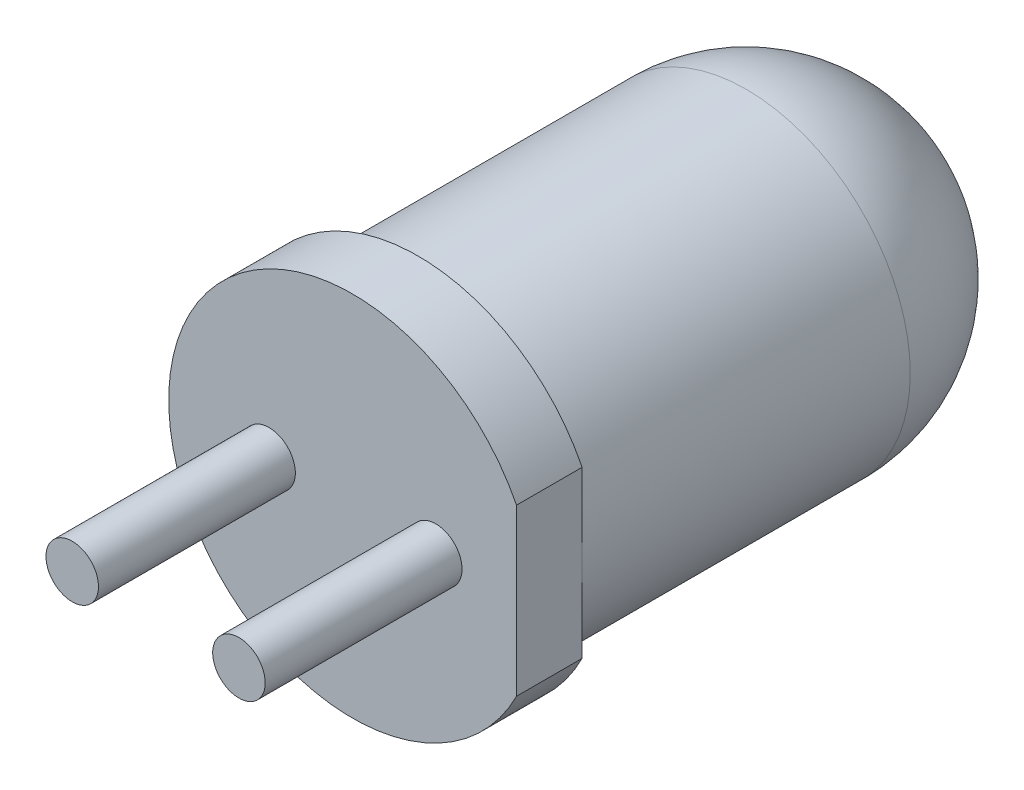
ISO-10303-21;
HEADER;
FILE_DESCRIPTION(('STEP AP214'),'2;1');
FILE_NAME('part.step','',(''),(''),'','','');
FILE_SCHEMA(('AUTOMOTIVE_DESIGN { 1 0 10303 214 1 1 1 1 }'));
ENDSEC;
DATA;
#1=APPLICATION_CONTEXT('core data for automotive mechanical design processes');
#2=APPLICATION_PROTOCOL_DEFINITION('international standard','automotive_design',2000,#1);
#3=PRODUCT_CONTEXT('',#1,'mechanical');
#4=PRODUCT('Part','Part','',(#3));
#5=PRODUCT_RELATED_PRODUCT_CATEGORY('part','',(#4));
#6=PRODUCT_DEFINITION_FORMATION('','',#4);
#7=PRODUCT_DEFINITION_CONTEXT('part definition',#1,'design');
#8=PRODUCT_DEFINITION('design','',#6,#7);
#9=PRODUCT_DEFINITION_SHAPE('','',#8);
#10=(LENGTH_UNIT() NAMED_UNIT(*) SI_UNIT(.MILLI.,.METRE.));
#11=(NAMED_UNIT(*) PLANE_ANGLE_UNIT() SI_UNIT($,.RADIAN.));
#12=(NAMED_UNIT(*) SI_UNIT($,.STERADIAN.) SOLID_ANGLE_UNIT());
#13=UNCERTAINTY_MEASURE_WITH_UNIT(LENGTH_MEASURE(1.E-05),#10,'distance_accuracy_value','');
#14=(GEOMETRIC_REPRESENTATION_CONTEXT(3) GLOBAL_UNCERTAINTY_ASSIGNED_CONTEXT((#13)) GLOBAL_UNIT_ASSIGNED_CONTEXT((#10,
#11,#12)) REPRESENTATION_CONTEXT('',''));
#15=CARTESIAN_POINT('',(0.,0.,0.));
#16=DIRECTION('',(0.,0.,1.));
#17=DIRECTION('',(1.,0.,0.));
#18=AXIS2_PLACEMENT_3D('',#15,#16,#17);
#19=CARTESIAN_POINT('',(0.,0.,8.5));
#20=DIRECTION('',(0.,0.,1.));
#21=DIRECTION('',(1.,0.,0.));
#22=AXIS2_PLACEMENT_3D('',#19,#20,#21);
#23=PLANE('',#22);
#24=CARTESIAN_POINT('',(1.27,0.,8.5));
#25=DIRECTION('',(0.,0.,1.));
#26=DIRECTION('',(1.,0.,0.));
#27=AXIS2_PLACEMENT_3D('',#24,#25,#26);
#28=CIRCLE('',#27,0.4);
#29=CARTESIAN_POINT('',(1.67,0.,8.5));
#30=VERTEX_POINT('',#29);
#31=EDGE_CURVE('E137',#30,#30,#28,.T.);
#32=ORIENTED_EDGE('',*,*,#31,.F.);
#33=EDGE_LOOP('',(#32));
#34=FACE_BOUND('',#33,.T.);
#35=DIRECTION('',(0.,1.,0.));
#36=VECTOR('',#35,1.);
#37=CARTESIAN_POINT('',(2.5,1.26095202129185,8.5));
#38=LINE('',#37,#36);
#39=CARTESIAN_POINT('',(2.5,-1.26095202129185,8.5));
#40=VERTEX_POINT('',#39);
#41=CARTESIAN_POINT('',(2.5,1.26095202129185,8.5));
#42=VERTEX_POINT('',#41);
#43=EDGE_CURVE('E81',#40,#42,#38,.T.);
#44=ORIENTED_EDGE('',*,*,#43,.T.);
#45=CARTESIAN_POINT('',(0.,0.,8.5));
#46=DIRECTION('',(0.,0.,1.));
#47=DIRECTION('',(1.,0.,0.));
#48=AXIS2_PLACEMENT_3D('',#45,#46,#47);
#49=CIRCLE('',#48,2.8);
#50=EDGE_CURVE('E71',#42,#40,#49,.T.);
#51=ORIENTED_EDGE('',*,*,#50,.T.);
#52=EDGE_LOOP('',(#44,#51));
#53=FACE_BOUND('',#52,.T.);
#54=CARTESIAN_POINT('',(-1.27,0.,8.5));
#55=DIRECTION('',(0.,0.,1.));
#56=DIRECTION('',(-1.,0.,0.));
#57=AXIS2_PLACEMENT_3D('',#54,#55,#56);
#58=CIRCLE('',#57,0.4);
#59=CARTESIAN_POINT('',(-1.67,0.,8.5));
#60=VERTEX_POINT('',#59);
#61=EDGE_CURVE('E138',#60,#60,#58,.T.);
#62=ORIENTED_EDGE('',*,*,#61,.F.);
#63=EDGE_LOOP('',(#62));
#64=FACE_BOUND('',#63,.T.);
#65=ADVANCED_FACE('F36',(#34,#53,#64),#23,.T.);
#66=CARTESIAN_POINT('',(0.,0.,8.5));
#67=DIRECTION('',(0.,0.,-1.));
#68=DIRECTION('',(-1.,0.,0.));
#69=AXIS2_PLACEMENT_3D('',#66,#67,#68);
#70=CYLINDRICAL_SURFACE('',#69,2.5);
#71=CARTESIAN_POINT('',(0.,0.,2.5));
#72=DIRECTION('',(0.,0.,-1.));
#73=DIRECTION('',(-1.,0.,0.));
#74=AXIS2_PLACEMENT_3D('',#71,#72,#73);
#75=CIRCLE('',#74,2.5);
#76=CARTESIAN_POINT('',(-2.5,0.,2.5));
#77=VERTEX_POINT('',#76);
#78=EDGE_CURVE('E11',#77,#77,#75,.F.);
#79=ORIENTED_EDGE('',*,*,#78,.T.);
#80=EDGE_LOOP('',(#79));
#81=FACE_BOUND('',#80,.T.);
#82=CARTESIAN_POINT('',(0.,0.,7.5));
#83=DIRECTION('',(0.,0.,1.));
#84=DIRECTION('',(1.,0.,0.));
#85=AXIS2_PLACEMENT_3D('',#82,#83,#84);
#86=CIRCLE('',#85,2.5);
#87=CARTESIAN_POINT('',(2.5,0.,7.5));
#88=VERTEX_POINT('',#87);
#89=EDGE_CURVE('E44',#88,#88,#86,.T.);
#90=ORIENTED_EDGE('',*,*,#89,.F.);
#91=EDGE_LOOP('',(#90));
#92=FACE_BOUND('',#91,.T.);
#93=ADVANCED_FACE('F38',(#81,#92),#70,.T.);
#94=CARTESIAN_POINT('',(0.,0.,7.5));
#95=DIRECTION('',(0.,0.,1.));
#96=DIRECTION('',(1.,0.,0.));
#97=AXIS2_PLACEMENT_3D('',#94,#95,#96);
#98=PLANE('',#97);
#99=DIRECTION('',(0.,1.,0.));
#100=VECTOR('',#99,1.);
#101=CARTESIAN_POINT('',(2.5,1.26095202129185,7.5));
#102=LINE('',#101,#100);
#103=CARTESIAN_POINT('',(2.5,1.26095202129185,7.5));
#104=VERTEX_POINT('',#103);
#105=EDGE_CURVE('E55',#88,#104,#102,.T.);
#106=ORIENTED_EDGE('',*,*,#105,.F.);
#107=ORIENTED_EDGE('',*,*,#89,.T.);
#108=CARTESIAN_POINT('',(2.5,-1.26095202129185,7.5));
#109=VERTEX_POINT('',#108);
#110=EDGE_CURVE('E77',#109,#88,#102,.T.);
#111=ORIENTED_EDGE('',*,*,#110,.F.);
#112=CARTESIAN_POINT('',(0.,0.,7.5));
#113=DIRECTION('',(0.,0.,1.));
#114=DIRECTION('',(1.,0.,0.));
#115=AXIS2_PLACEMENT_3D('',#112,#113,#114);
#116=CIRCLE('',#115,2.8);
#117=EDGE_CURVE('E73',#104,#109,#116,.T.);
#118=ORIENTED_EDGE('',*,*,#117,.F.);
#119=EDGE_LOOP('',(#106,#107,#111,#118));
#120=FACE_BOUND('',#119,.T.);
#121=ADVANCED_FACE('F91',(#120),#98,.F.);
#122=CARTESIAN_POINT('',(2.5,1.26095202129185,7.5));
#123=DIRECTION('',(1.,0.,0.));
#124=DIRECTION('',(0.,0.,-1.));
#125=AXIS2_PLACEMENT_3D('',#122,#123,#124);
#126=PLANE('',#125);
#127=ORIENTED_EDGE('',*,*,#110,.T.);
#128=ORIENTED_EDGE('',*,*,#105,.T.);
#129=DIRECTION('',(0.,0.,1.));
#130=VECTOR('',#129,1.);
#131=CARTESIAN_POINT('',(2.5,1.26095202129185,7.5));
#132=LINE('',#131,#130);
#133=EDGE_CURVE('E76',#104,#42,#132,.T.);
#134=ORIENTED_EDGE('',*,*,#133,.T.);
#135=ORIENTED_EDGE('',*,*,#43,.F.);
#136=DIRECTION('',(0.,0.,1.));
#137=VECTOR('',#136,1.);
#138=CARTESIAN_POINT('',(2.5,-1.26095202129185,7.5));
#139=LINE('',#138,#137);
#140=EDGE_CURVE('E68',#109,#40,#139,.T.);
#141=ORIENTED_EDGE('',*,*,#140,.F.);
#142=EDGE_LOOP('',(#127,#128,#134,#135,#141));
#143=FACE_BOUND('',#142,.T.);
#144=ADVANCED_FACE('F84',(#143),#126,.T.);
#145=CARTESIAN_POINT('',(0.,0.,7.5));
#146=DIRECTION('',(0.,0.,1.));
#147=DIRECTION('',(1.,0.,0.));
#148=AXIS2_PLACEMENT_3D('',#145,#146,#147);
#149=CYLINDRICAL_SURFACE('',#148,2.8);
#150=ORIENTED_EDGE('',*,*,#50,.F.);
#151=ORIENTED_EDGE('',*,*,#133,.F.);
#152=ORIENTED_EDGE('',*,*,#117,.T.);
#153=ORIENTED_EDGE('',*,*,#140,.T.);
#154=EDGE_LOOP('',(#150,#151,#152,#153));
#155=FACE_BOUND('',#154,.T.);
#156=ADVANCED_FACE('F70',(#155),#149,.T.);
#157=CARTESIAN_POINT('',(0.,0.,2.5));
#158=DIRECTION('',(0.,0.,1.));
#159=DIRECTION('',(1.,0.,0.));
#160=AXIS2_PLACEMENT_3D('',#157,#158,#159);
#161=SPHERICAL_SURFACE('',#160,2.5);
#162=ORIENTED_EDGE('',*,*,#78,.F.);
#163=EDGE_LOOP('',(#162));
#164=FACE_BOUND('',#163,.T.);
#165=ADVANCED_FACE('F108',(#164),#161,.T.);
#166=CARTESIAN_POINT('',(1.27,0.,11.5));
#167=DIRECTION('',(0.,0.,-1.));
#168=DIRECTION('',(-1.,0.,0.));
#169=AXIS2_PLACEMENT_3D('',#166,#167,#168);
#170=CYLINDRICAL_SURFACE('',#169,0.4);
#171=CARTESIAN_POINT('',(1.27,0.,11.5));
#172=DIRECTION('',(0.,0.,1.));
#173=DIRECTION('',(1.,0.,0.));
#174=AXIS2_PLACEMENT_3D('',#171,#172,#173);
#175=CIRCLE('',#174,0.4);
#176=CARTESIAN_POINT('',(1.67,0.,11.5));
#177=VERTEX_POINT('',#176);
#178=EDGE_CURVE('E82',#177,#177,#175,.T.);
#179=ORIENTED_EDGE('',*,*,#178,.F.);
#180=EDGE_LOOP('',(#179));
#181=FACE_BOUND('',#180,.T.);
#182=ORIENTED_EDGE('',*,*,#31,.T.);
#183=EDGE_LOOP('',(#182));
#184=FACE_BOUND('',#183,.T.);
#185=ADVANCED_FACE('F112',(#181,#184),#170,.T.);
#186=CARTESIAN_POINT('',(1.27,0.,11.5));
#187=DIRECTION('',(0.,0.,1.));
#188=DIRECTION('',(1.,0.,0.));
#189=AXIS2_PLACEMENT_3D('',#186,#187,#188);
#190=PLANE('',#189);
#191=ORIENTED_EDGE('',*,*,#178,.T.);
#192=EDGE_LOOP('',(#191));
#193=FACE_BOUND('',#192,.T.);
#194=ADVANCED_FACE('F117',(#193),#190,.T.);
#195=CARTESIAN_POINT('',(-1.27,0.,11.5));
#196=DIRECTION('',(0.,0.,-1.));
#197=DIRECTION('',(-1.,0.,0.));
#198=AXIS2_PLACEMENT_3D('',#195,#196,#197);
#199=CYLINDRICAL_SURFACE('',#198,0.4);
#200=CARTESIAN_POINT('',(-1.27,0.,11.5));
#201=DIRECTION('',(0.,0.,1.));
#202=DIRECTION('',(-1.,0.,0.));
#203=AXIS2_PLACEMENT_3D('',#200,#201,#202);
#204=CIRCLE('',#203,0.4);
#205=CARTESIAN_POINT('',(-1.67,0.,11.5));
#206=VERTEX_POINT('',#205);
#207=EDGE_CURVE('E136',#206,#206,#204,.T.);
#208=ORIENTED_EDGE('',*,*,#207,.F.);
#209=EDGE_LOOP('',(#208));
#210=FACE_BOUND('',#209,.T.);
#211=ORIENTED_EDGE('',*,*,#61,.T.);
#212=EDGE_LOOP('',(#211));
#213=FACE_BOUND('',#212,.T.);
#214=ADVANCED_FACE('F124',(#210,#213),#199,.T.);
#215=CARTESIAN_POINT('',(-1.27,0.,11.5));
#216=DIRECTION('',(0.,0.,-1.));
#217=DIRECTION('',(-1.,0.,0.));
#218=AXIS2_PLACEMENT_3D('',#215,#216,#217);
#219=PLANE('',#218);
#220=ORIENTED_EDGE('',*,*,#207,.T.);
#221=EDGE_LOOP('',(#220));
#222=FACE_BOUND('',#221,.T.);
#223=ADVANCED_FACE('F128',(#222),#219,.F.);
#224=CLOSED_SHELL('',(#65,#93,#121,#144,#156,#165,#185,#194,#214,#223));
#225=MANIFOLD_SOLID_BREP('B2',#224);
#226=ADVANCED_BREP_SHAPE_REPRESENTATION('',(#18,#225),#14);
#227=SHAPE_DEFINITION_REPRESENTATION(#9,#226);
ENDSEC;
END-ISO-10303-21;
